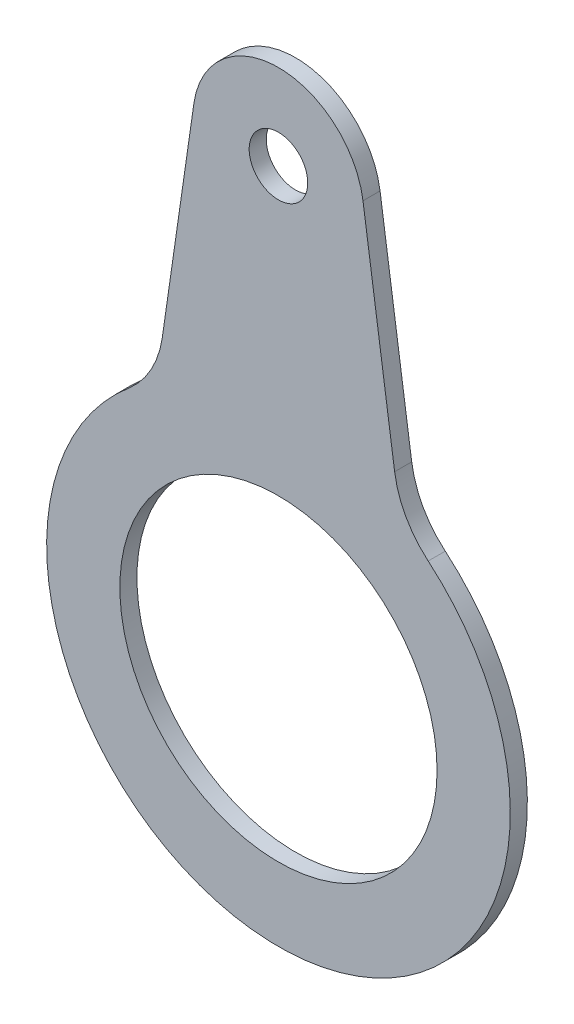
ISO-10303-21;
HEADER;
FILE_DESCRIPTION(('STEP AP214'),'2;1');
FILE_NAME('part.step','',(''),(''),'','','');
FILE_SCHEMA(('AUTOMOTIVE_DESIGN { 1 0 10303 214 1 1 1 1 }'));
ENDSEC;
DATA;
#1=APPLICATION_CONTEXT('core data for automotive mechanical design processes');
#2=APPLICATION_PROTOCOL_DEFINITION('international standard','automotive_design',2000,#1);
#3=PRODUCT_CONTEXT('',#1,'mechanical');
#4=PRODUCT('Part','Part','',(#3));
#5=PRODUCT_RELATED_PRODUCT_CATEGORY('part','',(#4));
#6=PRODUCT_DEFINITION_FORMATION('','',#4);
#7=PRODUCT_DEFINITION_CONTEXT('part definition',#1,'design');
#8=PRODUCT_DEFINITION('design','',#6,#7);
#9=PRODUCT_DEFINITION_SHAPE('','',#8);
#10=(LENGTH_UNIT() NAMED_UNIT(*) SI_UNIT(.MILLI.,.METRE.));
#11=(NAMED_UNIT(*) PLANE_ANGLE_UNIT() SI_UNIT($,.RADIAN.));
#12=(NAMED_UNIT(*) SI_UNIT($,.STERADIAN.) SOLID_ANGLE_UNIT());
#13=UNCERTAINTY_MEASURE_WITH_UNIT(LENGTH_MEASURE(1.E-05),#10,'distance_accuracy_value','');
#14=(GEOMETRIC_REPRESENTATION_CONTEXT(3) GLOBAL_UNCERTAINTY_ASSIGNED_CONTEXT((#13)) GLOBAL_UNIT_ASSIGNED_CONTEXT((#10,
#11,#12)) REPRESENTATION_CONTEXT('',''));
#15=CARTESIAN_POINT('',(0.,0.,0.));
#16=DIRECTION('',(0.,0.,1.));
#17=DIRECTION('',(1.,0.,0.));
#18=AXIS2_PLACEMENT_3D('',#15,#16,#17);
#19=CARTESIAN_POINT('',(-4.35967895268532,5.15322223754348,0.35));
#20=DIRECTION('',(0.,0.,1.));
#21=DIRECTION('',(1.,0.,0.));
#22=AXIS2_PLACEMENT_3D('',#19,#20,#21);
#23=PLANE('',#22);
#24=CARTESIAN_POINT('',(0.,0.,0.35));
#25=DIRECTION('',(0.,0.,1.));
#26=DIRECTION('',(1.,0.,0.));
#27=AXIS2_PLACEMENT_3D('',#24,#25,#26);
#28=CIRCLE('',#27,3.25);
#29=CARTESIAN_POINT('',(3.25,0.,0.35));
#30=VERTEX_POINT('',#29);
#31=EDGE_CURVE('E120',#30,#30,#28,.T.);
#32=ORIENTED_EDGE('',*,*,#31,.F.);
#33=EDGE_LOOP('',(#32));
#34=FACE_BOUND('',#33,.T.);
#35=CARTESIAN_POINT('',(-4.35967895268532,5.15322223754348,0.35));
#36=DIRECTION('',(0.,0.,-1.));
#37=DIRECTION('',(1.,0.,0.));
#38=AXIS2_PLACEMENT_3D('',#35,#36,#37);
#39=CIRCLE('',#38,2.);
#40=CARTESIAN_POINT('',(-2.38026150396029,4.86702900966606,0.35));
#41=VERTEX_POINT('',#40);
#42=CARTESIAN_POINT('',(-3.06792222596374,3.62634157456764,0.35));
#43=VERTEX_POINT('',#42);
#44=EDGE_CURVE('E127',#41,#43,#39,.T.);
#45=ORIENTED_EDGE('',*,*,#44,.T.);
#46=CARTESIAN_POINT('',(0.,0.,0.35));
#47=DIRECTION('',(0.,0.,1.));
#48=DIRECTION('',(1.,0.,0.));
#49=AXIS2_PLACEMENT_3D('',#46,#47,#48);
#50=CIRCLE('',#49,4.75);
#51=CARTESIAN_POINT('',(3.06792222596374,3.62634157456764,0.35));
#52=VERTEX_POINT('',#51);
#53=EDGE_CURVE('E85',#43,#52,#50,.T.);
#54=ORIENTED_EDGE('',*,*,#53,.T.);
#55=CARTESIAN_POINT('',(4.35967895268532,5.15322223754348,0.35));
#56=DIRECTION('',(0.,0.,-1.));
#57=DIRECTION('',(-1.,0.,0.));
#58=AXIS2_PLACEMENT_3D('',#55,#56,#57);
#59=CIRCLE('',#58,2.);
#60=CARTESIAN_POINT('',(2.38026150396029,4.86702900966605,0.35));
#61=VERTEX_POINT('',#60);
#62=EDGE_CURVE('E98',#52,#61,#59,.T.);
#63=ORIENTED_EDGE('',*,*,#62,.T.);
#64=DIRECTION('',(-0.143096613938714,0.989708724362514,0.));
#65=VECTOR('',#64,1.);
#66=CARTESIAN_POINT('',(2.38026150396029,4.86702900966606,0.35));
#67=LINE('',#66,#65);
#68=CARTESIAN_POINT('',(1.7319902676344,9.35071091299743,0.35));
#69=VERTEX_POINT('',#68);
#70=EDGE_CURVE('E92',#61,#69,#67,.T.);
#71=ORIENTED_EDGE('',*,*,#70,.T.);
#72=CARTESIAN_POINT('',(0.,9.10029183860468,0.35));
#73=DIRECTION('',(0.,0.,1.));
#74=DIRECTION('',(1.,0.,0.));
#75=AXIS2_PLACEMENT_3D('',#72,#73,#74);
#76=CIRCLE('',#75,1.75);
#77=CARTESIAN_POINT('',(-1.7319902676344,9.35071091299743,0.35));
#78=VERTEX_POINT('',#77);
#79=EDGE_CURVE('E96',#69,#78,#76,.T.);
#80=ORIENTED_EDGE('',*,*,#79,.T.);
#81=DIRECTION('',(-0.143096613938713,-0.989708724362514,0.));
#82=VECTOR('',#81,1.);
#83=CARTESIAN_POINT('',(-2.38026150396029,4.86702900966606,0.35));
#84=LINE('',#83,#82);
#85=EDGE_CURVE('E48',#78,#41,#84,.T.);
#86=ORIENTED_EDGE('',*,*,#85,.T.);
#87=EDGE_LOOP('',(#45,#54,#63,#71,#80,#86));
#88=FACE_BOUND('',#87,.T.);
#89=CARTESIAN_POINT('',(0.,9.10029183860468,0.35));
#90=DIRECTION('',(0.,0.,1.));
#91=DIRECTION('',(1.,0.,0.));
#92=AXIS2_PLACEMENT_3D('',#89,#90,#91);
#93=CIRCLE('',#92,0.6);
#94=CARTESIAN_POINT('',(0.6,9.10029183860468,0.35));
#95=VERTEX_POINT('',#94);
#96=EDGE_CURVE('E170',#95,#95,#93,.T.);
#97=ORIENTED_EDGE('',*,*,#96,.F.);
#98=EDGE_LOOP('',(#97));
#99=FACE_BOUND('',#98,.T.);
#100=ADVANCED_FACE('F31',(#34,#88,#99),#23,.T.);
#101=CARTESIAN_POINT('',(-4.35967895268532,5.15322223754348,0.));
#102=DIRECTION('',(0.,0.,1.));
#103=DIRECTION('',(1.,0.,0.));
#104=AXIS2_PLACEMENT_3D('',#101,#102,#103);
#105=PLANE('',#104);
#106=CARTESIAN_POINT('',(0.,0.,0.));
#107=DIRECTION('',(0.,0.,1.));
#108=DIRECTION('',(1.,0.,0.));
#109=AXIS2_PLACEMENT_3D('',#106,#107,#108);
#110=CIRCLE('',#109,3.25);
#111=CARTESIAN_POINT('',(3.25,0.,0.));
#112=VERTEX_POINT('',#111);
#113=EDGE_CURVE('E175',#112,#112,#110,.T.);
#114=ORIENTED_EDGE('',*,*,#113,.T.);
#115=EDGE_LOOP('',(#114));
#116=FACE_BOUND('',#115,.T.);
#117=CARTESIAN_POINT('',(-4.35967895268532,5.15322223754348,0.));
#118=DIRECTION('',(0.,0.,-1.));
#119=DIRECTION('',(1.,0.,0.));
#120=AXIS2_PLACEMENT_3D('',#117,#118,#119);
#121=CIRCLE('',#120,2.);
#122=CARTESIAN_POINT('',(-2.38026150396029,4.86702900966606,0.));
#123=VERTEX_POINT('',#122);
#124=CARTESIAN_POINT('',(-3.06792222596374,3.62634157456764,0.));
#125=VERTEX_POINT('',#124);
#126=EDGE_CURVE('E116',#123,#125,#121,.T.);
#127=ORIENTED_EDGE('',*,*,#126,.F.);
#128=DIRECTION('',(-0.143096613938713,-0.989708724362514,0.));
#129=VECTOR('',#128,1.);
#130=CARTESIAN_POINT('',(-2.38026150396029,4.86702900966606,0.));
#131=LINE('',#130,#129);
#132=CARTESIAN_POINT('',(-1.7319902676344,9.35071091299743,0.));
#133=VERTEX_POINT('',#132);
#134=EDGE_CURVE('E77',#133,#123,#131,.T.);
#135=ORIENTED_EDGE('',*,*,#134,.F.);
#136=CARTESIAN_POINT('',(0.,9.10029183860468,0.));
#137=DIRECTION('',(0.,0.,1.));
#138=DIRECTION('',(1.,0.,0.));
#139=AXIS2_PLACEMENT_3D('',#136,#137,#138);
#140=CIRCLE('',#139,1.75);
#141=CARTESIAN_POINT('',(1.7319902676344,9.35071091299743,0.));
#142=VERTEX_POINT('',#141);
#143=EDGE_CURVE('E71',#142,#133,#140,.T.);
#144=ORIENTED_EDGE('',*,*,#143,.F.);
#145=DIRECTION('',(-0.143096613938714,0.989708724362514,0.));
#146=VECTOR('',#145,1.);
#147=CARTESIAN_POINT('',(2.38026150396029,4.86702900966606,0.));
#148=LINE('',#147,#146);
#149=CARTESIAN_POINT('',(2.38026150396029,4.86702900966605,0.));
#150=VERTEX_POINT('',#149);
#151=EDGE_CURVE('E106',#150,#142,#148,.T.);
#152=ORIENTED_EDGE('',*,*,#151,.F.);
#153=CARTESIAN_POINT('',(4.35967895268532,5.15322223754348,0.));
#154=DIRECTION('',(0.,0.,-1.));
#155=DIRECTION('',(-1.,0.,0.));
#156=AXIS2_PLACEMENT_3D('',#153,#154,#155);
#157=CIRCLE('',#156,2.);
#158=CARTESIAN_POINT('',(3.06792222596374,3.62634157456764,0.));
#159=VERTEX_POINT('',#158);
#160=EDGE_CURVE('E122',#159,#150,#157,.T.);
#161=ORIENTED_EDGE('',*,*,#160,.F.);
#162=CARTESIAN_POINT('',(0.,0.,0.));
#163=DIRECTION('',(0.,0.,1.));
#164=DIRECTION('',(1.,0.,0.));
#165=AXIS2_PLACEMENT_3D('',#162,#163,#164);
#166=CIRCLE('',#165,4.75);
#167=EDGE_CURVE('E119',#125,#159,#166,.T.);
#168=ORIENTED_EDGE('',*,*,#167,.F.);
#169=EDGE_LOOP('',(#127,#135,#144,#152,#161,#168));
#170=FACE_BOUND('',#169,.T.);
#171=CARTESIAN_POINT('',(0.,9.10029183860468,0.));
#172=DIRECTION('',(0.,0.,1.));
#173=DIRECTION('',(1.,0.,0.));
#174=AXIS2_PLACEMENT_3D('',#171,#172,#173);
#175=CIRCLE('',#174,0.6);
#176=CARTESIAN_POINT('',(0.6,9.10029183860468,0.));
#177=VERTEX_POINT('',#176);
#178=EDGE_CURVE('E173',#177,#177,#175,.T.);
#179=ORIENTED_EDGE('',*,*,#178,.T.);
#180=EDGE_LOOP('',(#179));
#181=FACE_BOUND('',#180,.T.);
#182=ADVANCED_FACE('F136',(#116,#170,#181),#105,.F.);
#183=CARTESIAN_POINT('',(-4.35967895268532,5.15322223754348,0.35));
#184=DIRECTION('',(0.,0.,-1.));
#185=DIRECTION('',(-1.,0.,0.));
#186=AXIS2_PLACEMENT_3D('',#183,#184,#185);
#187=CYLINDRICAL_SURFACE('',#186,2.);
#188=ORIENTED_EDGE('',*,*,#126,.T.);
#189=DIRECTION('',(0.,0.,-1.));
#190=VECTOR('',#189,1.);
#191=CARTESIAN_POINT('',(-3.06792222596374,3.62634157456764,0.35));
#192=LINE('',#191,#190);
#193=EDGE_CURVE('E11',#43,#125,#192,.T.);
#194=ORIENTED_EDGE('',*,*,#193,.F.);
#195=ORIENTED_EDGE('',*,*,#44,.F.);
#196=DIRECTION('',(0.,0.,-1.));
#197=VECTOR('',#196,1.);
#198=CARTESIAN_POINT('',(-2.38026150396029,4.86702900966606,0.35));
#199=LINE('',#198,#197);
#200=EDGE_CURVE('E112',#41,#123,#199,.T.);
#201=ORIENTED_EDGE('',*,*,#200,.T.);
#202=EDGE_LOOP('',(#188,#194,#195,#201));
#203=FACE_BOUND('',#202,.T.);
#204=ADVANCED_FACE('F33',(#203),#187,.F.);
#205=CARTESIAN_POINT('',(0.,0.,0.35));
#206=DIRECTION('',(0.,0.,-1.));
#207=DIRECTION('',(-1.,0.,0.));
#208=AXIS2_PLACEMENT_3D('',#205,#206,#207);
#209=CYLINDRICAL_SURFACE('',#208,4.75);
#210=ORIENTED_EDGE('',*,*,#167,.T.);
#211=DIRECTION('',(0.,0.,-1.));
#212=VECTOR('',#211,1.);
#213=CARTESIAN_POINT('',(3.06792222596374,3.62634157456764,0.35));
#214=LINE('',#213,#212);
#215=EDGE_CURVE('E40',#52,#159,#214,.T.);
#216=ORIENTED_EDGE('',*,*,#215,.F.);
#217=ORIENTED_EDGE('',*,*,#53,.F.);
#218=ORIENTED_EDGE('',*,*,#193,.T.);
#219=EDGE_LOOP('',(#210,#216,#217,#218));
#220=FACE_BOUND('',#219,.T.);
#221=ADVANCED_FACE('F216',(#220),#209,.T.);
#222=CARTESIAN_POINT('',(4.35967895268532,5.15322223754348,0.35));
#223=DIRECTION('',(0.,0.,-1.));
#224=DIRECTION('',(-1.,0.,0.));
#225=AXIS2_PLACEMENT_3D('',#222,#223,#224);
#226=CYLINDRICAL_SURFACE('',#225,2.);
#227=ORIENTED_EDGE('',*,*,#160,.T.);
#228=DIRECTION('',(0.,0.,-1.));
#229=VECTOR('',#228,1.);
#230=CARTESIAN_POINT('',(2.38026150396029,4.86702900966605,0.35));
#231=LINE('',#230,#229);
#232=EDGE_CURVE('E107',#61,#150,#231,.T.);
#233=ORIENTED_EDGE('',*,*,#232,.F.);
#234=ORIENTED_EDGE('',*,*,#62,.F.);
#235=ORIENTED_EDGE('',*,*,#215,.T.);
#236=EDGE_LOOP('',(#227,#233,#234,#235));
#237=FACE_BOUND('',#236,.T.);
#238=ADVANCED_FACE('F133',(#237),#226,.F.);
#239=CARTESIAN_POINT('',(2.38026150396029,4.86702900966606,0.35));
#240=DIRECTION('',(-0.989708724362514,-0.143096613938714,0.));
#241=DIRECTION('',(0.143096613938714,-0.989708724362514,0.));
#242=AXIS2_PLACEMENT_3D('',#239,#240,#241);
#243=PLANE('',#242);
#244=ORIENTED_EDGE('',*,*,#151,.T.);
#245=DIRECTION('',(0.,0.,-1.));
#246=VECTOR('',#245,1.);
#247=CARTESIAN_POINT('',(1.7319902676344,9.35071091299743,0.35));
#248=LINE('',#247,#246);
#249=EDGE_CURVE('E103',#69,#142,#248,.T.);
#250=ORIENTED_EDGE('',*,*,#249,.F.);
#251=ORIENTED_EDGE('',*,*,#70,.F.);
#252=ORIENTED_EDGE('',*,*,#232,.T.);
#253=EDGE_LOOP('',(#244,#250,#251,#252));
#254=FACE_BOUND('',#253,.T.);
#255=ADVANCED_FACE('F104',(#254),#243,.F.);
#256=CARTESIAN_POINT('',(0.,9.10029183860468,0.35));
#257=DIRECTION('',(0.,0.,-1.));
#258=DIRECTION('',(-1.,0.,0.));
#259=AXIS2_PLACEMENT_3D('',#256,#257,#258);
#260=CYLINDRICAL_SURFACE('',#259,1.75);
#261=ORIENTED_EDGE('',*,*,#143,.T.);
#262=DIRECTION('',(0.,0.,-1.));
#263=VECTOR('',#262,1.);
#264=CARTESIAN_POINT('',(-1.7319902676344,9.35071091299743,0.35));
#265=LINE('',#264,#263);
#266=EDGE_CURVE('E108',#78,#133,#265,.T.);
#267=ORIENTED_EDGE('',*,*,#266,.F.);
#268=ORIENTED_EDGE('',*,*,#79,.F.);
#269=ORIENTED_EDGE('',*,*,#249,.T.);
#270=EDGE_LOOP('',(#261,#267,#268,#269));
#271=FACE_BOUND('',#270,.T.);
#272=ADVANCED_FACE('F110',(#271),#260,.T.);
#273=CARTESIAN_POINT('',(-2.38026150396029,4.86702900966606,0.35));
#274=DIRECTION('',(0.989708724362514,-0.143096613938713,0.));
#275=DIRECTION('',(0.143096613938713,0.989708724362514,0.));
#276=AXIS2_PLACEMENT_3D('',#273,#274,#275);
#277=PLANE('',#276);
#278=ORIENTED_EDGE('',*,*,#134,.T.);
#279=ORIENTED_EDGE('',*,*,#200,.F.);
#280=ORIENTED_EDGE('',*,*,#85,.F.);
#281=ORIENTED_EDGE('',*,*,#266,.T.);
#282=EDGE_LOOP('',(#278,#279,#280,#281));
#283=FACE_BOUND('',#282,.T.);
#284=ADVANCED_FACE('F141',(#283),#277,.F.);
#285=CARTESIAN_POINT('',(0.,0.,0.35));
#286=DIRECTION('',(0.,0.,-1.));
#287=DIRECTION('',(-1.,0.,0.));
#288=AXIS2_PLACEMENT_3D('',#285,#286,#287);
#289=CYLINDRICAL_SURFACE('',#288,3.25);
#290=ORIENTED_EDGE('',*,*,#31,.T.);
#291=EDGE_LOOP('',(#290));
#292=FACE_BOUND('',#291,.T.);
#293=ORIENTED_EDGE('',*,*,#113,.F.);
#294=EDGE_LOOP('',(#293));
#295=FACE_BOUND('',#294,.T.);
#296=ADVANCED_FACE('F143',(#292,#295),#289,.F.);
#297=CARTESIAN_POINT('',(0.,9.10029183860468,0.35));
#298=DIRECTION('',(0.,0.,-1.));
#299=DIRECTION('',(-1.,0.,0.));
#300=AXIS2_PLACEMENT_3D('',#297,#298,#299);
#301=CYLINDRICAL_SURFACE('',#300,0.6);
#302=ORIENTED_EDGE('',*,*,#96,.T.);
#303=EDGE_LOOP('',(#302));
#304=FACE_BOUND('',#303,.T.);
#305=ORIENTED_EDGE('',*,*,#178,.F.);
#306=EDGE_LOOP('',(#305));
#307=FACE_BOUND('',#306,.T.);
#308=ADVANCED_FACE('F149',(#304,#307),#301,.F.);
#309=CLOSED_SHELL('',(#100,#182,#204,#221,#238,#255,#272,#284,#296,#308));
#310=MANIFOLD_SOLID_BREP('B2',#309);
#311=ADVANCED_BREP_SHAPE_REPRESENTATION('',(#18,#310),#14);
#312=SHAPE_DEFINITION_REPRESENTATION(#9,#311);
ENDSEC;
END-ISO-10303-21;
